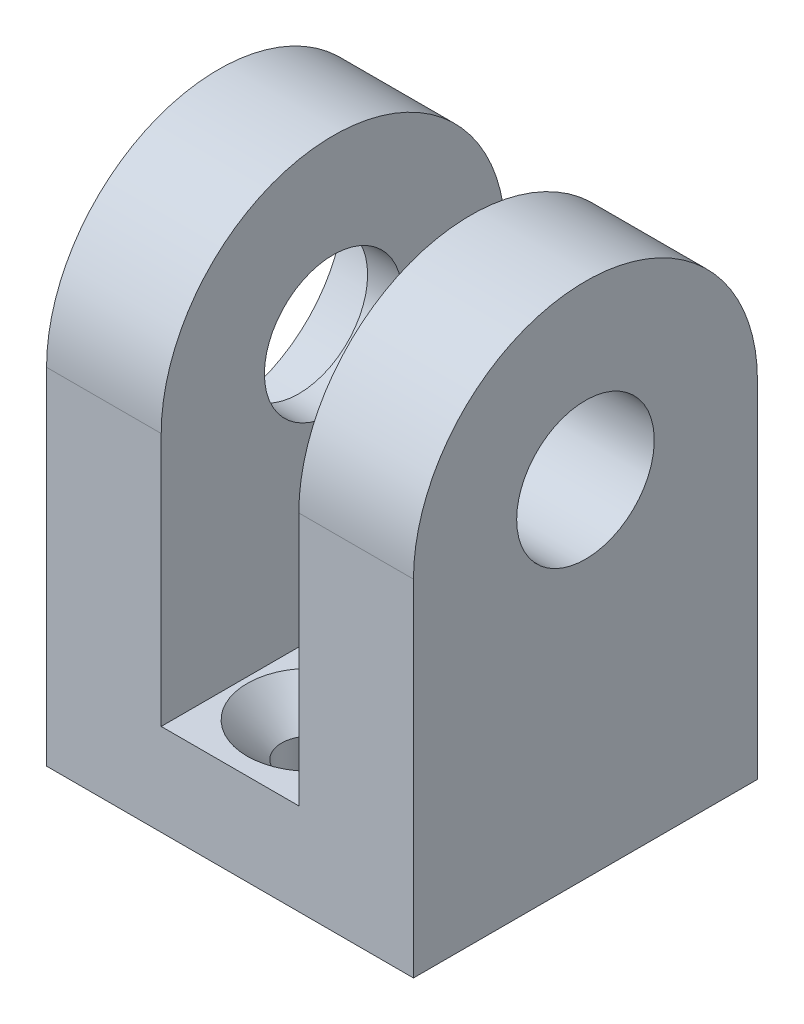
ISO-10303-21;
HEADER;
FILE_DESCRIPTION(('STEP AP214'),'2;1');
FILE_NAME('part.step','',(''),(''),'','','');
FILE_SCHEMA(('AUTOMOTIVE_DESIGN { 1 0 10303 214 1 1 1 1 }'));
ENDSEC;
DATA;
#1=APPLICATION_CONTEXT('core data for automotive mechanical design processes');
#2=APPLICATION_PROTOCOL_DEFINITION('international standard','automotive_design',2000,#1);
#3=PRODUCT_CONTEXT('',#1,'mechanical');
#4=PRODUCT('Part','Part','',(#3));
#5=PRODUCT_RELATED_PRODUCT_CATEGORY('part','',(#4));
#6=PRODUCT_DEFINITION_FORMATION('','',#4);
#7=PRODUCT_DEFINITION_CONTEXT('part definition',#1,'design');
#8=PRODUCT_DEFINITION('design','',#6,#7);
#9=PRODUCT_DEFINITION_SHAPE('','',#8);
#10=(LENGTH_UNIT() NAMED_UNIT(*) SI_UNIT(.MILLI.,.METRE.));
#11=(NAMED_UNIT(*) PLANE_ANGLE_UNIT() SI_UNIT($,.RADIAN.));
#12=(NAMED_UNIT(*) SI_UNIT($,.STERADIAN.) SOLID_ANGLE_UNIT());
#13=UNCERTAINTY_MEASURE_WITH_UNIT(LENGTH_MEASURE(1.E-05),#10,'distance_accuracy_value','');
#14=(GEOMETRIC_REPRESENTATION_CONTEXT(3) GLOBAL_UNCERTAINTY_ASSIGNED_CONTEXT((#13)) GLOBAL_UNIT_ASSIGNED_CONTEXT((#10,
#11,#12)) REPRESENTATION_CONTEXT('',''));
#15=CARTESIAN_POINT('',(0.,0.,0.));
#16=DIRECTION('',(0.,0.,1.));
#17=DIRECTION('',(1.,0.,0.));
#18=AXIS2_PLACEMENT_3D('',#15,#16,#17);
#19=CARTESIAN_POINT('',(0.,8.,0.));
#20=DIRECTION('',(0.,1.,0.));
#21=DIRECTION('',(0.,0.,1.));
#22=AXIS2_PLACEMENT_3D('',#19,#20,#21);
#23=PLANE('',#22);
#24=CARTESIAN_POINT('',(0.,8.,8.));
#25=DIRECTION('',(0.,1.,0.));
#26=DIRECTION('',(0.,0.,1.));
#27=AXIS2_PLACEMENT_3D('',#24,#25,#26);
#28=CIRCLE('',#27,5.50000000000001);
#29=CARTESIAN_POINT('',(0.,8.,13.5));
#30=VERTEX_POINT('',#29);
#31=EDGE_CURVE('E45',#30,#30,#28,.F.);
#32=ORIENTED_EDGE('',*,*,#31,.T.);
#33=EDGE_LOOP('',(#32));
#34=FACE_BOUND('',#33,.T.);
#35=CARTESIAN_POINT('',(0.,8.,-8.));
#36=DIRECTION('',(0.,1.,0.));
#37=DIRECTION('',(0.,0.,1.));
#38=AXIS2_PLACEMENT_3D('',#35,#36,#37);
#39=CIRCLE('',#38,5.50000000000001);
#40=CARTESIAN_POINT('',(0.,8.,-2.5));
#41=VERTEX_POINT('',#40);
#42=EDGE_CURVE('E189',#41,#41,#39,.F.);
#43=ORIENTED_EDGE('',*,*,#42,.T.);
#44=EDGE_LOOP('',(#43));
#45=FACE_BOUND('',#44,.T.);
#46=DIRECTION('',(1.,0.,0.));
#47=VECTOR('',#46,1.);
#48=CARTESIAN_POINT('',(-16.,8.,15.));
#49=LINE('',#48,#47);
#50=CARTESIAN_POINT('',(-6.,8.,15.));
#51=VERTEX_POINT('',#50);
#52=CARTESIAN_POINT('',(6.,8.,15.));
#53=VERTEX_POINT('',#52);
#54=EDGE_CURVE('E52',#51,#53,#49,.T.);
#55=ORIENTED_EDGE('',*,*,#54,.T.);
#56=DIRECTION('',(0.,0.,-1.));
#57=VECTOR('',#56,1.);
#58=CARTESIAN_POINT('',(6.,8.,0.));
#59=LINE('',#58,#57);
#60=CARTESIAN_POINT('',(6.,8.,-15.));
#61=VERTEX_POINT('',#60);
#62=EDGE_CURVE('E131',#53,#61,#59,.T.);
#63=ORIENTED_EDGE('',*,*,#62,.T.);
#64=DIRECTION('',(-1.,0.,0.));
#65=VECTOR('',#64,1.);
#66=CARTESIAN_POINT('',(-16.,8.,-15.));
#67=LINE('',#66,#65);
#68=CARTESIAN_POINT('',(-6.,8.,-15.));
#69=VERTEX_POINT('',#68);
#70=EDGE_CURVE('E57',#61,#69,#67,.T.);
#71=ORIENTED_EDGE('',*,*,#70,.T.);
#72=DIRECTION('',(0.,0.,1.));
#73=VECTOR('',#72,1.);
#74=CARTESIAN_POINT('',(-6.,8.,0.));
#75=LINE('',#74,#73);
#76=EDGE_CURVE('E158',#69,#51,#75,.T.);
#77=ORIENTED_EDGE('',*,*,#76,.T.);
#78=EDGE_LOOP('',(#55,#63,#71,#77));
#79=FACE_BOUND('',#78,.T.);
#80=ADVANCED_FACE('F36',(#34,#45,#79),#23,.T.);
#81=CARTESIAN_POINT('',(-16.,8.,-15.));
#82=DIRECTION('',(1.,0.,0.));
#83=DIRECTION('',(0.,0.,-1.));
#84=AXIS2_PLACEMENT_3D('',#81,#82,#83);
#85=PLANE('',#84);
#86=CARTESIAN_POINT('',(-16.,30.125,0.));
#87=DIRECTION('',(1.,0.,0.));
#88=DIRECTION('',(0.,0.,-1.));
#89=AXIS2_PLACEMENT_3D('',#86,#87,#88);
#90=CIRCLE('',#89,11.);
#91=CARTESIAN_POINT('',(-16.,30.125,-11.));
#92=VERTEX_POINT('',#91);
#93=EDGE_CURVE('E134',#92,#92,#90,.T.);
#94=ORIENTED_EDGE('',*,*,#93,.T.);
#95=EDGE_LOOP('',(#94));
#96=FACE_BOUND('',#95,.T.);
#97=DIRECTION('',(0.,0.,1.));
#98=VECTOR('',#97,1.);
#99=CARTESIAN_POINT('',(-16.,0.,-15.));
#100=LINE('',#99,#98);
#101=CARTESIAN_POINT('',(-16.,0.,-15.));
#102=VERTEX_POINT('',#101);
#103=CARTESIAN_POINT('',(-16.,0.,15.));
#104=VERTEX_POINT('',#103);
#105=EDGE_CURVE('E162',#102,#104,#100,.T.);
#106=ORIENTED_EDGE('',*,*,#105,.T.);
#107=DIRECTION('',(0.,-1.,0.));
#108=VECTOR('',#107,1.);
#109=CARTESIAN_POINT('',(-16.,8.,15.));
#110=LINE('',#109,#108);
#111=CARTESIAN_POINT('',(-16.,30.125,15.));
#112=VERTEX_POINT('',#111);
#113=EDGE_CURVE('E181',#112,#104,#110,.T.);
#114=ORIENTED_EDGE('',*,*,#113,.F.);
#115=CARTESIAN_POINT('',(-16.,30.125,0.));
#116=DIRECTION('',(-1.,0.,0.));
#117=DIRECTION('',(0.,0.,1.));
#118=AXIS2_PLACEMENT_3D('',#115,#116,#117);
#119=CIRCLE('',#118,15.);
#120=CARTESIAN_POINT('',(-16.,30.125,-15.));
#121=VERTEX_POINT('',#120);
#122=EDGE_CURVE('E144',#112,#121,#119,.T.);
#123=ORIENTED_EDGE('',*,*,#122,.T.);
#124=DIRECTION('',(0.,-1.,0.));
#125=VECTOR('',#124,1.);
#126=CARTESIAN_POINT('',(-16.,8.,-15.));
#127=LINE('',#126,#125);
#128=EDGE_CURVE('E166',#121,#102,#127,.T.);
#129=ORIENTED_EDGE('',*,*,#128,.T.);
#130=EDGE_LOOP('',(#106,#114,#123,#129));
#131=FACE_BOUND('',#130,.T.);
#132=ADVANCED_FACE('F232',(#96,#131),#85,.F.);
#133=CARTESIAN_POINT('',(-16.,8.,15.));
#134=DIRECTION('',(0.,0.,-1.));
#135=DIRECTION('',(-1.,0.,0.));
#136=AXIS2_PLACEMENT_3D('',#133,#134,#135);
#137=PLANE('',#136);
#138=DIRECTION('',(0.,-1.,0.));
#139=VECTOR('',#138,1.);
#140=CARTESIAN_POINT('',(16.,8.,15.));
#141=LINE('',#140,#139);
#142=CARTESIAN_POINT('',(16.,30.125,15.));
#143=VERTEX_POINT('',#142);
#144=CARTESIAN_POINT('',(16.,0.,15.));
#145=VERTEX_POINT('',#144);
#146=EDGE_CURVE('E178',#143,#145,#141,.T.);
#147=ORIENTED_EDGE('',*,*,#146,.F.);
#148=DIRECTION('',(1.,0.,0.));
#149=VECTOR('',#148,1.);
#150=CARTESIAN_POINT('',(6.,30.125,15.));
#151=LINE('',#150,#149);
#152=CARTESIAN_POINT('',(6.,30.125,15.));
#153=VERTEX_POINT('',#152);
#154=EDGE_CURVE('E121',#153,#143,#151,.T.);
#155=ORIENTED_EDGE('',*,*,#154,.F.);
#156=DIRECTION('',(0.,1.,0.));
#157=VECTOR('',#156,1.);
#158=CARTESIAN_POINT('',(6.,0.,15.));
#159=LINE('',#158,#157);
#160=EDGE_CURVE('E108',#53,#153,#159,.T.);
#161=ORIENTED_EDGE('',*,*,#160,.F.);
#162=ORIENTED_EDGE('',*,*,#54,.F.);
#163=DIRECTION('',(0.,1.,0.));
#164=VECTOR('',#163,1.);
#165=CARTESIAN_POINT('',(-6.,0.,15.));
#166=LINE('',#165,#164);
#167=CARTESIAN_POINT('',(-6.,30.125,15.));
#168=VERTEX_POINT('',#167);
#169=EDGE_CURVE('E145',#51,#168,#166,.T.);
#170=ORIENTED_EDGE('',*,*,#169,.T.);
#171=DIRECTION('',(-1.,0.,0.));
#172=VECTOR('',#171,1.);
#173=CARTESIAN_POINT('',(-6.,30.125,15.));
#174=LINE('',#173,#172);
#175=EDGE_CURVE('E152',#168,#112,#174,.T.);
#176=ORIENTED_EDGE('',*,*,#175,.T.);
#177=ORIENTED_EDGE('',*,*,#113,.T.);
#178=DIRECTION('',(1.,0.,0.));
#179=VECTOR('',#178,1.);
#180=CARTESIAN_POINT('',(-16.,0.,15.));
#181=LINE('',#180,#179);
#182=EDGE_CURVE('E169',#104,#145,#181,.T.);
#183=ORIENTED_EDGE('',*,*,#182,.T.);
#184=EDGE_LOOP('',(#147,#155,#161,#162,#170,#176,#177,#183));
#185=FACE_BOUND('',#184,.T.);
#186=ADVANCED_FACE('F237',(#185),#137,.F.);
#187=CARTESIAN_POINT('',(16.,8.,-15.));
#188=DIRECTION('',(-1.,0.,0.));
#189=DIRECTION('',(0.,0.,1.));
#190=AXIS2_PLACEMENT_3D('',#187,#188,#189);
#191=PLANE('',#190);
#192=DIRECTION('',(0.,0.,-1.));
#193=VECTOR('',#192,1.);
#194=CARTESIAN_POINT('',(16.,0.,-15.));
#195=LINE('',#194,#193);
#196=CARTESIAN_POINT('',(16.,0.,-15.));
#197=VERTEX_POINT('',#196);
#198=EDGE_CURVE('E171',#145,#197,#195,.T.);
#199=ORIENTED_EDGE('',*,*,#198,.T.);
#200=DIRECTION('',(0.,-1.,0.));
#201=VECTOR('',#200,1.);
#202=CARTESIAN_POINT('',(16.,8.,-15.));
#203=LINE('',#202,#201);
#204=CARTESIAN_POINT('',(16.,30.125,-15.));
#205=VERTEX_POINT('',#204);
#206=EDGE_CURVE('E176',#205,#197,#203,.T.);
#207=ORIENTED_EDGE('',*,*,#206,.F.);
#208=CARTESIAN_POINT('',(16.,30.125,0.));
#209=DIRECTION('',(-1.,0.,0.));
#210=DIRECTION('',(0.,0.,1.));
#211=AXIS2_PLACEMENT_3D('',#208,#209,#210);
#212=CIRCLE('',#211,15.);
#213=EDGE_CURVE('E118',#143,#205,#212,.T.);
#214=ORIENTED_EDGE('',*,*,#213,.F.);
#215=ORIENTED_EDGE('',*,*,#146,.T.);
#216=EDGE_LOOP('',(#199,#207,#214,#215));
#217=FACE_BOUND('',#216,.T.);
#218=CARTESIAN_POINT('',(16.,30.125,0.));
#219=DIRECTION('',(-1.,0.,0.));
#220=DIRECTION('',(0.,0.,1.));
#221=AXIS2_PLACEMENT_3D('',#218,#219,#220);
#222=CIRCLE('',#221,6.);
#223=CARTESIAN_POINT('',(16.,30.125,6.));
#224=VERTEX_POINT('',#223);
#225=EDGE_CURVE('E214',#224,#224,#222,.T.);
#226=ORIENTED_EDGE('',*,*,#225,.T.);
#227=EDGE_LOOP('',(#226));
#228=FACE_BOUND('',#227,.T.);
#229=ADVANCED_FACE('F221',(#217,#228),#191,.F.);
#230=CARTESIAN_POINT('',(-16.,8.,-15.));
#231=DIRECTION('',(0.,0.,1.));
#232=DIRECTION('',(1.,0.,0.));
#233=AXIS2_PLACEMENT_3D('',#230,#231,#232);
#234=PLANE('',#233);
#235=DIRECTION('',(-1.,0.,0.));
#236=VECTOR('',#235,1.);
#237=CARTESIAN_POINT('',(-16.,0.,-15.));
#238=LINE('',#237,#236);
#239=EDGE_CURVE('E164',#197,#102,#238,.T.);
#240=ORIENTED_EDGE('',*,*,#239,.T.);
#241=ORIENTED_EDGE('',*,*,#128,.F.);
#242=DIRECTION('',(-1.,0.,0.));
#243=VECTOR('',#242,1.);
#244=CARTESIAN_POINT('',(-6.,30.125,-15.));
#245=LINE('',#244,#243);
#246=CARTESIAN_POINT('',(-6.,30.125,-15.));
#247=VERTEX_POINT('',#246);
#248=EDGE_CURVE('E155',#247,#121,#245,.T.);
#249=ORIENTED_EDGE('',*,*,#248,.F.);
#250=DIRECTION('',(0.,-1.,0.));
#251=VECTOR('',#250,1.);
#252=CARTESIAN_POINT('',(-6.,0.,-15.));
#253=LINE('',#252,#251);
#254=EDGE_CURVE('E150',#247,#69,#253,.T.);
#255=ORIENTED_EDGE('',*,*,#254,.T.);
#256=ORIENTED_EDGE('',*,*,#70,.F.);
#257=DIRECTION('',(0.,-1.,0.));
#258=VECTOR('',#257,1.);
#259=CARTESIAN_POINT('',(6.,0.,-15.));
#260=LINE('',#259,#258);
#261=CARTESIAN_POINT('',(6.,30.125,-15.));
#262=VERTEX_POINT('',#261);
#263=EDGE_CURVE('E106',#262,#61,#260,.T.);
#264=ORIENTED_EDGE('',*,*,#263,.F.);
#265=DIRECTION('',(1.,0.,0.));
#266=VECTOR('',#265,1.);
#267=CARTESIAN_POINT('',(6.,30.125,-15.));
#268=LINE('',#267,#266);
#269=EDGE_CURVE('E112',#262,#205,#268,.T.);
#270=ORIENTED_EDGE('',*,*,#269,.T.);
#271=ORIENTED_EDGE('',*,*,#206,.T.);
#272=EDGE_LOOP('',(#240,#241,#249,#255,#256,#264,#270,#271));
#273=FACE_BOUND('',#272,.T.);
#274=ADVANCED_FACE('F123',(#273),#234,.F.);
#275=CARTESIAN_POINT('',(0.,0.,0.));
#276=DIRECTION('',(0.,1.,0.));
#277=DIRECTION('',(0.,0.,1.));
#278=AXIS2_PLACEMENT_3D('',#275,#276,#277);
#279=PLANE('',#278);
#280=CARTESIAN_POINT('',(0.,0.,-8.));
#281=DIRECTION('',(0.,1.,0.));
#282=DIRECTION('',(0.,0.,1.));
#283=AXIS2_PLACEMENT_3D('',#280,#281,#282);
#284=CIRCLE('',#283,2.5);
#285=CARTESIAN_POINT('',(0.,0.,-5.5));
#286=VERTEX_POINT('',#285);
#287=EDGE_CURVE('E211',#286,#286,#284,.T.);
#288=ORIENTED_EDGE('',*,*,#287,.T.);
#289=EDGE_LOOP('',(#288));
#290=FACE_BOUND('',#289,.T.);
#291=CARTESIAN_POINT('',(0.,0.,8.));
#292=DIRECTION('',(0.,1.,0.));
#293=DIRECTION('',(0.,0.,1.));
#294=AXIS2_PLACEMENT_3D('',#291,#292,#293);
#295=CIRCLE('',#294,2.5);
#296=CARTESIAN_POINT('',(0.,0.,10.5));
#297=VERTEX_POINT('',#296);
#298=EDGE_CURVE('E209',#297,#297,#295,.T.);
#299=ORIENTED_EDGE('',*,*,#298,.T.);
#300=EDGE_LOOP('',(#299));
#301=FACE_BOUND('',#300,.T.);
#302=ORIENTED_EDGE('',*,*,#198,.F.);
#303=ORIENTED_EDGE('',*,*,#182,.F.);
#304=ORIENTED_EDGE('',*,*,#105,.F.);
#305=ORIENTED_EDGE('',*,*,#239,.F.);
#306=EDGE_LOOP('',(#302,#303,#304,#305));
#307=FACE_BOUND('',#306,.T.);
#308=ADVANCED_FACE('F244',(#290,#301,#307),#279,.F.);
#309=CARTESIAN_POINT('',(-6.,30.125,0.));
#310=DIRECTION('',(-1.,0.,0.));
#311=DIRECTION('',(0.,0.,1.));
#312=AXIS2_PLACEMENT_3D('',#309,#310,#311);
#313=CYLINDRICAL_SURFACE('',#312,15.);
#314=ORIENTED_EDGE('',*,*,#122,.F.);
#315=ORIENTED_EDGE('',*,*,#175,.F.);
#316=CARTESIAN_POINT('',(-6.,30.125,0.));
#317=DIRECTION('',(-1.,0.,0.));
#318=DIRECTION('',(0.,0.,1.));
#319=AXIS2_PLACEMENT_3D('',#316,#317,#318);
#320=CIRCLE('',#319,15.);
#321=EDGE_CURVE('E147',#168,#247,#320,.T.);
#322=ORIENTED_EDGE('',*,*,#321,.T.);
#323=ORIENTED_EDGE('',*,*,#248,.T.);
#324=EDGE_LOOP('',(#314,#315,#322,#323));
#325=FACE_BOUND('',#324,.T.);
#326=ADVANCED_FACE('F242',(#325),#313,.T.);
#327=CARTESIAN_POINT('',(-6.,30.125,0.));
#328=DIRECTION('',(-1.,0.,0.));
#329=DIRECTION('',(0.,0.,1.));
#330=AXIS2_PLACEMENT_3D('',#327,#328,#329);
#331=PLANE('',#330);
#332=ORIENTED_EDGE('',*,*,#76,.F.);
#333=ORIENTED_EDGE('',*,*,#254,.F.);
#334=ORIENTED_EDGE('',*,*,#321,.F.);
#335=ORIENTED_EDGE('',*,*,#169,.F.);
#336=EDGE_LOOP('',(#332,#333,#334,#335));
#337=FACE_BOUND('',#336,.T.);
#338=CARTESIAN_POINT('',(-6.,30.125,0.));
#339=DIRECTION('',(-1.,0.,0.));
#340=DIRECTION('',(0.,0.,1.));
#341=AXIS2_PLACEMENT_3D('',#338,#339,#340);
#342=CIRCLE('',#341,6.);
#343=CARTESIAN_POINT('',(-6.,30.125,6.));
#344=VERTEX_POINT('',#343);
#345=EDGE_CURVE('E141',#344,#344,#342,.T.);
#346=ORIENTED_EDGE('',*,*,#345,.T.);
#347=EDGE_LOOP('',(#346));
#348=FACE_BOUND('',#347,.T.);
#349=ADVANCED_FACE('F274',(#337,#348),#331,.F.);
#350=CARTESIAN_POINT('',(-6.,30.125,0.));
#351=DIRECTION('',(-1.,0.,0.));
#352=DIRECTION('',(0.,0.,1.));
#353=AXIS2_PLACEMENT_3D('',#350,#351,#352);
#354=CYLINDRICAL_SURFACE('',#353,6.);
#355=CARTESIAN_POINT('',(-9.,30.125,0.));
#356=DIRECTION('',(1.,0.,0.));
#357=DIRECTION('',(0.,0.,-1.));
#358=AXIS2_PLACEMENT_3D('',#355,#356,#357);
#359=CIRCLE('',#358,6.);
#360=CARTESIAN_POINT('',(-9.,30.125,-6.));
#361=VERTEX_POINT('',#360);
#362=EDGE_CURVE('E138',#361,#361,#359,.F.);
#363=ORIENTED_EDGE('',*,*,#362,.T.);
#364=EDGE_LOOP('',(#363));
#365=FACE_BOUND('',#364,.T.);
#366=ORIENTED_EDGE('',*,*,#345,.F.);
#367=EDGE_LOOP('',(#366));
#368=FACE_BOUND('',#367,.T.);
#369=ADVANCED_FACE('F277',(#365,#368),#354,.F.);
#370=CARTESIAN_POINT('',(-9.,30.125,0.));
#371=DIRECTION('',(1.,0.,0.));
#372=DIRECTION('',(0.,0.,-1.));
#373=AXIS2_PLACEMENT_3D('',#370,#371,#372);
#374=PLANE('',#373);
#375=CARTESIAN_POINT('',(-9.,30.125,0.));
#376=DIRECTION('',(1.,0.,0.));
#377=DIRECTION('',(0.,0.,-1.));
#378=AXIS2_PLACEMENT_3D('',#375,#376,#377);
#379=CIRCLE('',#378,11.);
#380=CARTESIAN_POINT('',(-9.,30.125,-11.));
#381=VERTEX_POINT('',#380);
#382=EDGE_CURVE('E135',#381,#381,#379,.T.);
#383=ORIENTED_EDGE('',*,*,#382,.F.);
#384=EDGE_LOOP('',(#383));
#385=FACE_BOUND('',#384,.T.);
#386=ORIENTED_EDGE('',*,*,#362,.F.);
#387=EDGE_LOOP('',(#386));
#388=FACE_BOUND('',#387,.T.);
#389=ADVANCED_FACE('F281',(#385,#388),#374,.F.);
#390=CARTESIAN_POINT('',(-9.,30.125,0.));
#391=DIRECTION('',(-1.,0.,0.));
#392=DIRECTION('',(0.,0.,1.));
#393=AXIS2_PLACEMENT_3D('',#390,#391,#392);
#394=CYLINDRICAL_SURFACE('',#393,11.);
#395=ORIENTED_EDGE('',*,*,#382,.T.);
#396=EDGE_LOOP('',(#395));
#397=FACE_BOUND('',#396,.T.);
#398=ORIENTED_EDGE('',*,*,#93,.F.);
#399=EDGE_LOOP('',(#398));
#400=FACE_BOUND('',#399,.T.);
#401=ADVANCED_FACE('F287',(#397,#400),#394,.F.);
#402=CARTESIAN_POINT('',(6.,30.125,0.));
#403=DIRECTION('',(1.,0.,0.));
#404=DIRECTION('',(0.,0.,1.));
#405=AXIS2_PLACEMENT_3D('',#402,#403,#404);
#406=PLANE('',#405);
#407=ORIENTED_EDGE('',*,*,#62,.F.);
#408=ORIENTED_EDGE('',*,*,#160,.T.);
#409=CARTESIAN_POINT('',(6.,30.125,0.));
#410=DIRECTION('',(-1.,0.,0.));
#411=DIRECTION('',(0.,0.,1.));
#412=AXIS2_PLACEMENT_3D('',#409,#410,#411);
#413=CIRCLE('',#412,15.);
#414=EDGE_CURVE('E101',#153,#262,#413,.T.);
#415=ORIENTED_EDGE('',*,*,#414,.T.);
#416=ORIENTED_EDGE('',*,*,#263,.T.);
#417=EDGE_LOOP('',(#407,#408,#415,#416));
#418=FACE_BOUND('',#417,.T.);
#419=CARTESIAN_POINT('',(6.,30.125,0.));
#420=DIRECTION('',(-1.,0.,0.));
#421=DIRECTION('',(0.,0.,1.));
#422=AXIS2_PLACEMENT_3D('',#419,#420,#421);
#423=CIRCLE('',#422,6.);
#424=CARTESIAN_POINT('',(6.,30.125,6.));
#425=VERTEX_POINT('',#424);
#426=EDGE_CURVE('E130',#425,#425,#423,.T.);
#427=ORIENTED_EDGE('',*,*,#426,.F.);
#428=EDGE_LOOP('',(#427));
#429=FACE_BOUND('',#428,.T.);
#430=ADVANCED_FACE('F103',(#418,#429),#406,.F.);
#431=CARTESIAN_POINT('',(6.,30.125,0.));
#432=DIRECTION('',(1.,0.,0.));
#433=DIRECTION('',(0.,0.,-1.));
#434=AXIS2_PLACEMENT_3D('',#431,#432,#433);
#435=CYLINDRICAL_SURFACE('',#434,15.);
#436=ORIENTED_EDGE('',*,*,#213,.T.);
#437=ORIENTED_EDGE('',*,*,#269,.F.);
#438=ORIENTED_EDGE('',*,*,#414,.F.);
#439=ORIENTED_EDGE('',*,*,#154,.T.);
#440=EDGE_LOOP('',(#436,#437,#438,#439));
#441=FACE_BOUND('',#440,.T.);
#442=ADVANCED_FACE('F116',(#441),#435,.T.);
#443=CARTESIAN_POINT('',(6.,30.125,0.));
#444=DIRECTION('',(1.,0.,0.));
#445=DIRECTION('',(0.,0.,-1.));
#446=AXIS2_PLACEMENT_3D('',#443,#444,#445);
#447=CYLINDRICAL_SURFACE('',#446,6.);
#448=ORIENTED_EDGE('',*,*,#426,.T.);
#449=EDGE_LOOP('',(#448));
#450=FACE_BOUND('',#449,.T.);
#451=ORIENTED_EDGE('',*,*,#225,.F.);
#452=EDGE_LOOP('',(#451));
#453=FACE_BOUND('',#452,.T.);
#454=ADVANCED_FACE('F205',(#450,#453),#447,.F.);
#455=CARTESIAN_POINT('',(0.,0.,8.));
#456=DIRECTION('',(0.,1.,0.));
#457=DIRECTION('',(0.,0.,1.));
#458=AXIS2_PLACEMENT_3D('',#455,#456,#457);
#459=CYLINDRICAL_SURFACE('',#458,2.5);
#460=CARTESIAN_POINT('',(0.,5.,8.));
#461=DIRECTION('',(0.,1.,0.));
#462=DIRECTION('',(0.,0.,1.));
#463=AXIS2_PLACEMENT_3D('',#460,#461,#462);
#464=CIRCLE('',#463,2.5);
#465=CARTESIAN_POINT('',(0.,5.,10.5));
#466=VERTEX_POINT('',#465);
#467=EDGE_CURVE('E184',#466,#466,#464,.T.);
#468=ORIENTED_EDGE('',*,*,#467,.T.);
#469=EDGE_LOOP('',(#468));
#470=FACE_BOUND('',#469,.T.);
#471=ORIENTED_EDGE('',*,*,#298,.F.);
#472=EDGE_LOOP('',(#471));
#473=FACE_BOUND('',#472,.T.);
#474=ADVANCED_FACE('F202',(#470,#473),#459,.F.);
#475=CARTESIAN_POINT('',(0.,0.,-8.));
#476=DIRECTION('',(0.,1.,0.));
#477=DIRECTION('',(0.,0.,1.));
#478=AXIS2_PLACEMENT_3D('',#475,#476,#477);
#479=CYLINDRICAL_SURFACE('',#478,2.5);
#480=CARTESIAN_POINT('',(0.,5.,-8.));
#481=DIRECTION('',(0.,1.,0.));
#482=DIRECTION('',(0.,0.,1.));
#483=AXIS2_PLACEMENT_3D('',#480,#481,#482);
#484=CIRCLE('',#483,2.5);
#485=CARTESIAN_POINT('',(0.,5.,-5.5));
#486=VERTEX_POINT('',#485);
#487=EDGE_CURVE('E11',#486,#486,#484,.T.);
#488=ORIENTED_EDGE('',*,*,#487,.T.);
#489=EDGE_LOOP('',(#488));
#490=FACE_BOUND('',#489,.T.);
#491=ORIENTED_EDGE('',*,*,#287,.F.);
#492=EDGE_LOOP('',(#491));
#493=FACE_BOUND('',#492,.T.);
#494=ADVANCED_FACE('F199',(#490,#493),#479,.F.);
#495=CARTESIAN_POINT('',(0.,5.,8.));
#496=DIRECTION('',(0.,1.,0.));
#497=DIRECTION('',(0.,0.,1.));
#498=AXIS2_PLACEMENT_3D('',#495,#496,#497);
#499=CONICAL_SURFACE('',#498,2.5,0.785398163397449);
#500=ORIENTED_EDGE('',*,*,#31,.F.);
#501=EDGE_LOOP('',(#500));
#502=FACE_BOUND('',#501,.T.);
#503=ORIENTED_EDGE('',*,*,#467,.F.);
#504=EDGE_LOOP('',(#503));
#505=FACE_BOUND('',#504,.T.);
#506=ADVANCED_FACE('F196',(#502,#505),#499,.F.);
#507=CARTESIAN_POINT('',(0.,5.,-8.));
#508=DIRECTION('',(0.,1.,0.));
#509=DIRECTION('',(0.,0.,1.));
#510=AXIS2_PLACEMENT_3D('',#507,#508,#509);
#511=CONICAL_SURFACE('',#510,2.5,0.785398163397449);
#512=ORIENTED_EDGE('',*,*,#42,.F.);
#513=EDGE_LOOP('',(#512));
#514=FACE_BOUND('',#513,.T.);
#515=ORIENTED_EDGE('',*,*,#487,.F.);
#516=EDGE_LOOP('',(#515));
#517=FACE_BOUND('',#516,.T.);
#518=ADVANCED_FACE('F39',(#514,#517),#511,.F.);
#519=CLOSED_SHELL('',(#80,#132,#186,#229,#274,#308,#326,#349,#369,#389,#401,#430,#442,#454,#474,
#494,#506,#518));
#520=MANIFOLD_SOLID_BREP('B2',#519);
#521=ADVANCED_BREP_SHAPE_REPRESENTATION('',(#18,#520),#14);
#522=SHAPE_DEFINITION_REPRESENTATION(#9,#521);
ENDSEC;
END-ISO-10303-21;
